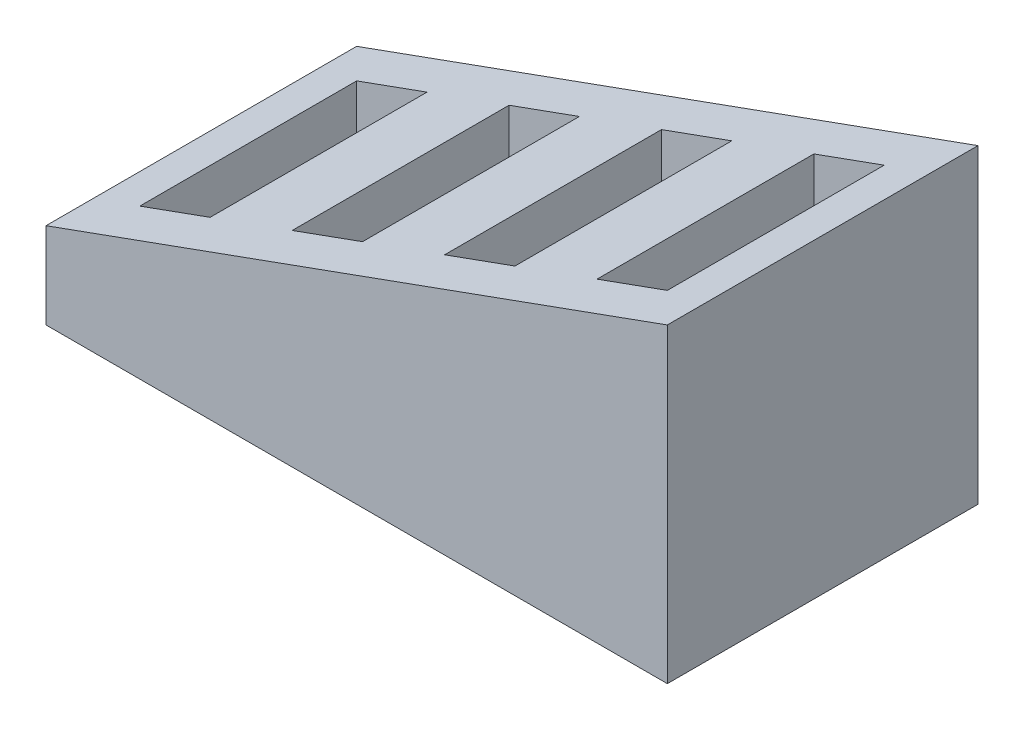
ISO-10303-21;
HEADER;
FILE_DESCRIPTION(('STEP AP214'),'2;1');
FILE_NAME('part.step','',(''),(''),'','','');
FILE_SCHEMA(('AUTOMOTIVE_DESIGN { 1 0 10303 214 1 1 1 1 }'));
ENDSEC;
DATA;
#1=APPLICATION_CONTEXT('core data for automotive mechanical design processes');
#2=APPLICATION_PROTOCOL_DEFINITION('international standard','automotive_design',2000,#1);
#3=PRODUCT_CONTEXT('',#1,'mechanical');
#4=PRODUCT('Part','Part','',(#3));
#5=PRODUCT_RELATED_PRODUCT_CATEGORY('part','',(#4));
#6=PRODUCT_DEFINITION_FORMATION('','',#4);
#7=PRODUCT_DEFINITION_CONTEXT('part definition',#1,'design');
#8=PRODUCT_DEFINITION('design','',#6,#7);
#9=PRODUCT_DEFINITION_SHAPE('','',#8);
#10=(LENGTH_UNIT() NAMED_UNIT(*) SI_UNIT(.MILLI.,.METRE.));
#11=(NAMED_UNIT(*) PLANE_ANGLE_UNIT() SI_UNIT($,.RADIAN.));
#12=(NAMED_UNIT(*) SI_UNIT($,.STERADIAN.) SOLID_ANGLE_UNIT());
#13=UNCERTAINTY_MEASURE_WITH_UNIT(LENGTH_MEASURE(1.E-05),#10,'distance_accuracy_value','');
#14=(GEOMETRIC_REPRESENTATION_CONTEXT(3) GLOBAL_UNCERTAINTY_ASSIGNED_CONTEXT((#13)) GLOBAL_UNIT_ASSIGNED_CONTEXT((#10,
#11,#12)) REPRESENTATION_CONTEXT('',''));
#15=CARTESIAN_POINT('',(0.,0.,0.));
#16=DIRECTION('',(0.,0.,1.));
#17=DIRECTION('',(1.,0.,0.));
#18=AXIS2_PLACEMENT_3D('',#15,#16,#17);
#19=CARTESIAN_POINT('',(-15.4919034710546,1.07152438082928,-7.95));
#20=DIRECTION('',(-0.34008044078782,0.940396349308929,0.));
#21=DIRECTION('',(-0.940396349308929,-0.34008044078782,0.));
#22=AXIS2_PLACEMENT_3D('',#19,#20,#21);
#23=PLANE('',#22);
#24=DIRECTION('',(-0.940396349308929,-0.34008044078782,0.));
#25=VECTOR('',#24,1.);
#26=CARTESIAN_POINT('',(-15.4919034710546,1.07152438082928,-6.75));
#27=LINE('',#26,#25);
#28=CARTESIAN_POINT('',(-10.8,2.76828192539306,-6.75));
#29=VERTEX_POINT('',#28);
#30=CARTESIAN_POINT('',(-12.9,2.00884796312891,-6.75));
#31=VERTEX_POINT('',#30);
#32=EDGE_CURVE('E261',#29,#31,#27,.T.);
#33=ORIENTED_EDGE('',*,*,#32,.F.);
#34=DIRECTION('',(0.,0.,1.));
#35=VECTOR('',#34,1.);
#36=CARTESIAN_POINT('',(-10.8,2.76828192539306,-7.95));
#37=LINE('',#36,#35);
#38=CARTESIAN_POINT('',(-10.8,2.76828192539306,-1.2));
#39=VERTEX_POINT('',#38);
#40=EDGE_CURVE('E227',#29,#39,#37,.T.);
#41=ORIENTED_EDGE('',*,*,#40,.T.);
#42=DIRECTION('',(-0.940396349308929,-0.34008044078782,0.));
#43=VECTOR('',#42,1.);
#44=CARTESIAN_POINT('',(-15.4919034710546,1.07152438082928,-1.2));
#45=LINE('',#44,#43);
#46=CARTESIAN_POINT('',(-12.9,2.00884796312891,-1.2));
#47=VERTEX_POINT('',#46);
#48=EDGE_CURVE('E183',#39,#47,#45,.T.);
#49=ORIENTED_EDGE('',*,*,#48,.T.);
#50=DIRECTION('',(0.,0.,-1.));
#51=VECTOR('',#50,1.);
#52=CARTESIAN_POINT('',(-12.9,2.00884796312891,-7.95));
#53=LINE('',#52,#51);
#54=EDGE_CURVE('E244',#47,#31,#53,.T.);
#55=ORIENTED_EDGE('',*,*,#54,.T.);
#56=EDGE_LOOP('',(#33,#41,#49,#55));
#57=FACE_BOUND('',#56,.T.);
#58=ADVANCED_FACE('F34',(#57),#23,.F.);
#59=CARTESIAN_POINT('',(-6.90000000000003,4.17865928388362,-1.2));
#60=VERTEX_POINT('',#59);
#61=CARTESIAN_POINT('',(-9.00000000000003,3.41922532161947,-1.2));
#62=VERTEX_POINT('',#61);
#63=EDGE_CURVE('E264',#60,#62,#45,.T.);
#64=ORIENTED_EDGE('',*,*,#63,.T.);
#65=DIRECTION('',(0.,0.,-1.));
#66=VECTOR('',#65,1.);
#67=CARTESIAN_POINT('',(-9.00000000000002,3.41922532161947,-7.95));
#68=LINE('',#67,#66);
#69=CARTESIAN_POINT('',(-9.00000000000003,3.41922532161947,-6.75));
#70=VERTEX_POINT('',#69);
#71=EDGE_CURVE('E222',#62,#70,#68,.T.);
#72=ORIENTED_EDGE('',*,*,#71,.T.);
#73=CARTESIAN_POINT('',(-6.90000000000003,4.17865928388362,-6.75));
#74=VERTEX_POINT('',#73);
#75=EDGE_CURVE('E267',#74,#70,#27,.T.);
#76=ORIENTED_EDGE('',*,*,#75,.F.);
#77=DIRECTION('',(0.,0.,1.));
#78=VECTOR('',#77,1.);
#79=CARTESIAN_POINT('',(-6.90000000000003,4.17865928388362,-7.95));
#80=LINE('',#79,#78);
#81=EDGE_CURVE('E217',#74,#60,#80,.T.);
#82=ORIENTED_EDGE('',*,*,#81,.T.);
#83=EDGE_LOOP('',(#64,#72,#76,#82));
#84=FACE_BOUND('',#83,.T.);
#85=ADVANCED_FACE('F334',(#84),#23,.F.);
#86=CARTESIAN_POINT('',(0.,0.,-7.95));
#87=DIRECTION('',(0.,-1.,0.));
#88=DIRECTION('',(1.,0.,0.));
#89=AXIS2_PLACEMENT_3D('',#86,#87,#88);
#90=PLANE('',#89);
#91=DIRECTION('',(1.,0.,0.));
#92=VECTOR('',#91,1.);
#93=CARTESIAN_POINT('',(0.,0.,0.));
#94=LINE('',#93,#92);
#95=CARTESIAN_POINT('',(-15.9,0.,0.));
#96=VERTEX_POINT('',#95);
#97=CARTESIAN_POINT('',(0.,0.,0.));
#98=VERTEX_POINT('',#97);
#99=EDGE_CURVE('E286',#96,#98,#94,.T.);
#100=ORIENTED_EDGE('',*,*,#99,.F.);
#101=DIRECTION('',(0.,0.,1.));
#102=VECTOR('',#101,1.);
#103=CARTESIAN_POINT('',(-15.9,0.,-7.95));
#104=LINE('',#103,#102);
#105=CARTESIAN_POINT('',(-15.9,0.,-7.95));
#106=VERTEX_POINT('',#105);
#107=EDGE_CURVE('E43',#106,#96,#104,.T.);
#108=ORIENTED_EDGE('',*,*,#107,.F.);
#109=DIRECTION('',(1.,0.,0.));
#110=VECTOR('',#109,1.);
#111=CARTESIAN_POINT('',(0.,0.,-7.95));
#112=LINE('',#111,#110);
#113=CARTESIAN_POINT('',(0.,0.,-7.95));
#114=VERTEX_POINT('',#113);
#115=EDGE_CURVE('E292',#106,#114,#112,.T.);
#116=ORIENTED_EDGE('',*,*,#115,.T.);
#117=DIRECTION('',(0.,0.,1.));
#118=VECTOR('',#117,1.);
#119=CARTESIAN_POINT('',(0.,0.,-7.95));
#120=LINE('',#119,#118);
#121=EDGE_CURVE('E11',#114,#98,#120,.T.);
#122=ORIENTED_EDGE('',*,*,#121,.T.);
#123=EDGE_LOOP('',(#100,#108,#116,#122));
#124=FACE_BOUND('',#123,.T.);
#125=DIRECTION('',(0.,0.,1.));
#126=VECTOR('',#125,1.);
#127=CARTESIAN_POINT('',(-14.7,0.,-7.95));
#128=LINE('',#127,#126);
#129=CARTESIAN_POINT('',(-14.7,0.,-6.75));
#130=VERTEX_POINT('',#129);
#131=CARTESIAN_POINT('',(-14.7,0.,-1.2));
#132=VERTEX_POINT('',#131);
#133=EDGE_CURVE('E277',#130,#132,#128,.T.);
#134=ORIENTED_EDGE('',*,*,#133,.T.);
#135=DIRECTION('',(1.,0.,0.));
#136=VECTOR('',#135,1.);
#137=CARTESIAN_POINT('',(0.,0.,-1.2));
#138=LINE('',#137,#136);
#139=CARTESIAN_POINT('',(-1.2,0.,-1.2));
#140=VERTEX_POINT('',#139);
#141=EDGE_CURVE('E262',#132,#140,#138,.T.);
#142=ORIENTED_EDGE('',*,*,#141,.T.);
#143=DIRECTION('',(0.,0.,1.));
#144=VECTOR('',#143,1.);
#145=CARTESIAN_POINT('',(-1.2,0.,-7.95));
#146=LINE('',#145,#144);
#147=CARTESIAN_POINT('',(-1.2,0.,-6.75));
#148=VERTEX_POINT('',#147);
#149=EDGE_CURVE('E180',#148,#140,#146,.T.);
#150=ORIENTED_EDGE('',*,*,#149,.F.);
#151=DIRECTION('',(1.,0.,0.));
#152=VECTOR('',#151,1.);
#153=CARTESIAN_POINT('',(0.,0.,-6.75));
#154=LINE('',#153,#152);
#155=EDGE_CURVE('E274',#130,#148,#154,.T.);
#156=ORIENTED_EDGE('',*,*,#155,.F.);
#157=EDGE_LOOP('',(#134,#142,#150,#156));
#158=FACE_BOUND('',#157,.T.);
#159=ADVANCED_FACE('F317',(#124,#158),#90,.T.);
#160=CARTESIAN_POINT('',(0.,7.95,-7.95));
#161=DIRECTION('',(1.,0.,0.));
#162=DIRECTION('',(0.,1.,0.));
#163=AXIS2_PLACEMENT_3D('',#160,#161,#162);
#164=PLANE('',#163);
#165=DIRECTION('',(0.,1.,0.));
#166=VECTOR('',#165,1.);
#167=CARTESIAN_POINT('',(0.,7.95,0.));
#168=LINE('',#167,#166);
#169=CARTESIAN_POINT('',(0.,7.95,0.));
#170=VERTEX_POINT('',#169);
#171=EDGE_CURVE('E276',#98,#170,#168,.T.);
#172=ORIENTED_EDGE('',*,*,#171,.F.);
#173=ORIENTED_EDGE('',*,*,#121,.F.);
#174=DIRECTION('',(0.,1.,0.));
#175=VECTOR('',#174,1.);
#176=CARTESIAN_POINT('',(0.,7.95,-7.95));
#177=LINE('',#176,#175);
#178=CARTESIAN_POINT('',(0.,7.95,-7.95));
#179=VERTEX_POINT('',#178);
#180=EDGE_CURVE('E282',#114,#179,#177,.T.);
#181=ORIENTED_EDGE('',*,*,#180,.T.);
#182=DIRECTION('',(0.,0.,1.));
#183=VECTOR('',#182,1.);
#184=CARTESIAN_POINT('',(0.,7.95,-7.95));
#185=LINE('',#184,#183);
#186=EDGE_CURVE('E38',#179,#170,#185,.T.);
#187=ORIENTED_EDGE('',*,*,#186,.T.);
#188=EDGE_LOOP('',(#172,#173,#181,#187));
#189=FACE_BOUND('',#188,.T.);
#190=ADVANCED_FACE('F36',(#189),#164,.T.);
#191=CARTESIAN_POINT('',(-15.9,0.,-7.95));
#192=DIRECTION('',(-1.,0.,0.));
#193=DIRECTION('',(0.,0.,1.));
#194=AXIS2_PLACEMENT_3D('',#191,#192,#193);
#195=PLANE('',#194);
#196=DIRECTION('',(0.,-1.,0.));
#197=VECTOR('',#196,1.);
#198=CARTESIAN_POINT('',(-15.9,0.,0.));
#199=LINE('',#198,#197);
#200=CARTESIAN_POINT('',(-15.9,2.2,0.));
#201=VERTEX_POINT('',#200);
#202=EDGE_CURVE('E300',#201,#96,#199,.T.);
#203=ORIENTED_EDGE('',*,*,#202,.F.);
#204=DIRECTION('',(0.,0.,1.));
#205=VECTOR('',#204,1.);
#206=CARTESIAN_POINT('',(-15.9,2.2,-7.95));
#207=LINE('',#206,#205);
#208=CARTESIAN_POINT('',(-15.9,2.2,-7.95));
#209=VERTEX_POINT('',#208);
#210=EDGE_CURVE('E305',#209,#201,#207,.T.);
#211=ORIENTED_EDGE('',*,*,#210,.F.);
#212=DIRECTION('',(0.,-1.,0.));
#213=VECTOR('',#212,1.);
#214=CARTESIAN_POINT('',(-15.9,0.,-7.95));
#215=LINE('',#214,#213);
#216=EDGE_CURVE('E289',#209,#106,#215,.T.);
#217=ORIENTED_EDGE('',*,*,#216,.T.);
#218=ORIENTED_EDGE('',*,*,#107,.T.);
#219=EDGE_LOOP('',(#203,#211,#217,#218));
#220=FACE_BOUND('',#219,.T.);
#221=ADVANCED_FACE('F324',(#220),#195,.T.);
#222=CARTESIAN_POINT('',(-15.9,2.2,-7.95));
#223=DIRECTION('',(-0.34008044078782,0.940396349308929,0.));
#224=DIRECTION('',(-0.940396349308929,-0.34008044078782,0.));
#225=AXIS2_PLACEMENT_3D('',#222,#223,#224);
#226=PLANE('',#225);
#227=DIRECTION('',(0.,0.,1.));
#228=VECTOR('',#227,1.);
#229=CARTESIAN_POINT('',(-10.8,4.04433962264151,-7.95));
#230=LINE('',#229,#228);
#231=CARTESIAN_POINT('',(-10.8,4.04433962264151,-6.75));
#232=VERTEX_POINT('',#231);
#233=CARTESIAN_POINT('',(-10.8,4.04433962264151,-1.2));
#234=VERTEX_POINT('',#233);
#235=EDGE_CURVE('E230',#232,#234,#230,.T.);
#236=ORIENTED_EDGE('',*,*,#235,.F.);
#237=DIRECTION('',(-0.940396349308929,-0.34008044078782,0.));
#238=VECTOR('',#237,1.);
#239=CARTESIAN_POINT('',(-15.9,2.2,-6.75));
#240=LINE('',#239,#238);
#241=CARTESIAN_POINT('',(-9.00000000000002,4.69528301886792,-6.75));
#242=VERTEX_POINT('',#241);
#243=EDGE_CURVE('E236',#242,#232,#240,.T.);
#244=ORIENTED_EDGE('',*,*,#243,.F.);
#245=DIRECTION('',(0.,0.,-1.));
#246=VECTOR('',#245,1.);
#247=CARTESIAN_POINT('',(-9.00000000000002,4.69528301886792,-7.95));
#248=LINE('',#247,#246);
#249=CARTESIAN_POINT('',(-9.00000000000003,4.69528301886792,-1.2));
#250=VERTEX_POINT('',#249);
#251=EDGE_CURVE('E225',#250,#242,#248,.T.);
#252=ORIENTED_EDGE('',*,*,#251,.F.);
#253=DIRECTION('',(0.940396349308929,0.34008044078782,0.));
#254=VECTOR('',#253,1.);
#255=CARTESIAN_POINT('',(-15.9,2.2,-1.2));
#256=LINE('',#255,#254);
#257=EDGE_CURVE('E238',#234,#250,#256,.T.);
#258=ORIENTED_EDGE('',*,*,#257,.F.);
#259=EDGE_LOOP('',(#236,#244,#252,#258));
#260=FACE_BOUND('',#259,.T.);
#261=DIRECTION('',(0.,0.,1.));
#262=VECTOR('',#261,1.);
#263=CARTESIAN_POINT('',(-6.90000000000003,5.45471698113207,-7.95));
#264=LINE('',#263,#262);
#265=CARTESIAN_POINT('',(-6.90000000000003,5.45471698113207,-6.75));
#266=VERTEX_POINT('',#265);
#267=CARTESIAN_POINT('',(-6.90000000000003,5.45471698113207,-1.2));
#268=VERTEX_POINT('',#267);
#269=EDGE_CURVE('E220',#266,#268,#264,.T.);
#270=ORIENTED_EDGE('',*,*,#269,.F.);
#271=DIRECTION('',(-0.940396349308929,-0.34008044078782,0.));
#272=VECTOR('',#271,1.);
#273=CARTESIAN_POINT('',(-15.9,2.2,-6.75000000000001));
#274=LINE('',#273,#272);
#275=CARTESIAN_POINT('',(-5.10000000000003,6.10566037735848,-6.75));
#276=VERTEX_POINT('',#275);
#277=EDGE_CURVE('E194',#276,#266,#274,.T.);
#278=ORIENTED_EDGE('',*,*,#277,.F.);
#279=DIRECTION('',(0.,0.,-1.));
#280=VECTOR('',#279,1.);
#281=CARTESIAN_POINT('',(-5.10000000000003,6.10566037735848,-7.95));
#282=LINE('',#281,#280);
#283=CARTESIAN_POINT('',(-5.10000000000003,6.10566037735848,-1.2));
#284=VERTEX_POINT('',#283);
#285=EDGE_CURVE('E215',#284,#276,#282,.T.);
#286=ORIENTED_EDGE('',*,*,#285,.F.);
#287=DIRECTION('',(0.940396349308929,0.34008044078782,0.));
#288=VECTOR('',#287,1.);
#289=CARTESIAN_POINT('',(-15.9,2.2,-1.2));
#290=LINE('',#289,#288);
#291=EDGE_CURVE('E234',#268,#284,#290,.T.);
#292=ORIENTED_EDGE('',*,*,#291,.F.);
#293=EDGE_LOOP('',(#270,#278,#286,#292));
#294=FACE_BOUND('',#293,.T.);
#295=DIRECTION('',(0.,0.,1.));
#296=VECTOR('',#295,1.);
#297=CARTESIAN_POINT('',(-3.00000000000003,6.86509433962263,-7.95));
#298=LINE('',#297,#296);
#299=CARTESIAN_POINT('',(-3.00000000000003,6.86509433962263,-6.75));
#300=VERTEX_POINT('',#299);
#301=CARTESIAN_POINT('',(-3.00000000000003,6.86509433962263,-1.2));
#302=VERTEX_POINT('',#301);
#303=EDGE_CURVE('E203',#300,#302,#298,.T.);
#304=ORIENTED_EDGE('',*,*,#303,.F.);
#305=DIRECTION('',(-0.940396349308929,-0.34008044078782,0.));
#306=VECTOR('',#305,1.);
#307=CARTESIAN_POINT('',(-15.9,2.2,-6.75000000000001));
#308=LINE('',#307,#306);
#309=CARTESIAN_POINT('',(-1.20000000000003,7.51603773584905,-6.75));
#310=VERTEX_POINT('',#309);
#311=EDGE_CURVE('E195',#310,#300,#308,.T.);
#312=ORIENTED_EDGE('',*,*,#311,.F.);
#313=DIRECTION('',(0.,0.,-1.));
#314=VECTOR('',#313,1.);
#315=CARTESIAN_POINT('',(-1.20000000000003,7.51603773584905,-7.95));
#316=LINE('',#315,#314);
#317=CARTESIAN_POINT('',(-1.20000000000003,7.51603773584905,-1.2));
#318=VERTEX_POINT('',#317);
#319=EDGE_CURVE('E177',#318,#310,#316,.T.);
#320=ORIENTED_EDGE('',*,*,#319,.F.);
#321=DIRECTION('',(0.940396349308929,0.34008044078782,0.));
#322=VECTOR('',#321,1.);
#323=CARTESIAN_POINT('',(-15.9,2.2,-1.2));
#324=LINE('',#323,#322);
#325=EDGE_CURVE('E188',#302,#318,#324,.T.);
#326=ORIENTED_EDGE('',*,*,#325,.F.);
#327=EDGE_LOOP('',(#304,#312,#320,#326));
#328=FACE_BOUND('',#327,.T.);
#329=DIRECTION('',(0.,0.,1.));
#330=VECTOR('',#329,1.);
#331=CARTESIAN_POINT('',(-14.7,2.63396226415094,-7.95));
#332=LINE('',#331,#330);
#333=CARTESIAN_POINT('',(-14.7,2.63396226415094,-6.75));
#334=VERTEX_POINT('',#333);
#335=CARTESIAN_POINT('',(-14.7,2.63396226415094,-1.2));
#336=VERTEX_POINT('',#335);
#337=EDGE_CURVE('E252',#334,#336,#332,.T.);
#338=ORIENTED_EDGE('',*,*,#337,.F.);
#339=DIRECTION('',(-0.940396349308929,-0.34008044078782,0.));
#340=VECTOR('',#339,1.);
#341=CARTESIAN_POINT('',(-15.9,2.2,-6.75));
#342=LINE('',#341,#340);
#343=CARTESIAN_POINT('',(-12.9,3.28490566037736,-6.75));
#344=VERTEX_POINT('',#343);
#345=EDGE_CURVE('E255',#344,#334,#342,.T.);
#346=ORIENTED_EDGE('',*,*,#345,.F.);
#347=DIRECTION('',(0.,0.,-1.));
#348=VECTOR('',#347,1.);
#349=CARTESIAN_POINT('',(-12.9,3.28490566037735,-7.95));
#350=LINE('',#349,#348);
#351=CARTESIAN_POINT('',(-12.9,3.28490566037735,-1.2));
#352=VERTEX_POINT('',#351);
#353=EDGE_CURVE('E249',#352,#344,#350,.T.);
#354=ORIENTED_EDGE('',*,*,#353,.F.);
#355=DIRECTION('',(0.940396349308929,0.34008044078782,0.));
#356=VECTOR('',#355,1.);
#357=CARTESIAN_POINT('',(-15.9,2.2,-1.2));
#358=LINE('',#357,#356);
#359=EDGE_CURVE('E184',#336,#352,#358,.T.);
#360=ORIENTED_EDGE('',*,*,#359,.F.);
#361=EDGE_LOOP('',(#338,#346,#354,#360));
#362=FACE_BOUND('',#361,.T.);
#363=DIRECTION('',(-0.940396349308929,-0.34008044078782,0.));
#364=VECTOR('',#363,1.);
#365=CARTESIAN_POINT('',(-15.9,2.2,0.));
#366=LINE('',#365,#364);
#367=EDGE_CURVE('E297',#170,#201,#366,.T.);
#368=ORIENTED_EDGE('',*,*,#367,.F.);
#369=ORIENTED_EDGE('',*,*,#186,.F.);
#370=DIRECTION('',(-0.940396349308929,-0.34008044078782,0.));
#371=VECTOR('',#370,1.);
#372=CARTESIAN_POINT('',(-15.9,2.2,-7.95));
#373=LINE('',#372,#371);
#374=EDGE_CURVE('E285',#179,#209,#373,.T.);
#375=ORIENTED_EDGE('',*,*,#374,.T.);
#376=ORIENTED_EDGE('',*,*,#210,.T.);
#377=EDGE_LOOP('',(#368,#369,#375,#376));
#378=FACE_BOUND('',#377,.T.);
#379=ADVANCED_FACE('F197',(#260,#294,#328,#362,#378),#226,.T.);
#380=CARTESIAN_POINT('',(0.,0.,-7.95));
#381=DIRECTION('',(0.,0.,-1.));
#382=DIRECTION('',(-1.,0.,0.));
#383=AXIS2_PLACEMENT_3D('',#380,#381,#382);
#384=PLANE('',#383);
#385=ORIENTED_EDGE('',*,*,#180,.F.);
#386=ORIENTED_EDGE('',*,*,#115,.F.);
#387=ORIENTED_EDGE('',*,*,#216,.F.);
#388=ORIENTED_EDGE('',*,*,#374,.F.);
#389=EDGE_LOOP('',(#385,#386,#387,#388));
#390=FACE_BOUND('',#389,.T.);
#391=ADVANCED_FACE('F321',(#390),#384,.T.);
#392=CARTESIAN_POINT('',(0.,0.,0.));
#393=DIRECTION('',(0.,0.,-1.));
#394=DIRECTION('',(-1.,0.,0.));
#395=AXIS2_PLACEMENT_3D('',#392,#393,#394);
#396=PLANE('',#395);
#397=ORIENTED_EDGE('',*,*,#171,.T.);
#398=ORIENTED_EDGE('',*,*,#367,.T.);
#399=ORIENTED_EDGE('',*,*,#202,.T.);
#400=ORIENTED_EDGE('',*,*,#99,.T.);
#401=EDGE_LOOP('',(#397,#398,#399,#400));
#402=FACE_BOUND('',#401,.T.);
#403=ADVANCED_FACE('F314',(#402),#396,.F.);
#404=CARTESIAN_POINT('',(-1.2,7.95,-7.95));
#405=DIRECTION('',(1.,0.,0.));
#406=DIRECTION('',(0.,1.,0.));
#407=AXIS2_PLACEMENT_3D('',#404,#405,#406);
#408=PLANE('',#407);
#409=DIRECTION('',(0.,1.,0.));
#410=VECTOR('',#409,1.);
#411=CARTESIAN_POINT('',(-1.2,7.95,-1.2));
#412=LINE('',#411,#410);
#413=EDGE_CURVE('E172',#140,#318,#412,.T.);
#414=ORIENTED_EDGE('',*,*,#413,.T.);
#415=ORIENTED_EDGE('',*,*,#319,.T.);
#416=DIRECTION('',(0.,1.,0.));
#417=VECTOR('',#416,1.);
#418=CARTESIAN_POINT('',(-1.2,7.95,-6.75));
#419=LINE('',#418,#417);
#420=EDGE_CURVE('E259',#148,#310,#419,.T.);
#421=ORIENTED_EDGE('',*,*,#420,.F.);
#422=ORIENTED_EDGE('',*,*,#149,.T.);
#423=EDGE_LOOP('',(#414,#415,#421,#422));
#424=FACE_BOUND('',#423,.T.);
#425=ADVANCED_FACE('F174',(#424),#408,.F.);
#426=CARTESIAN_POINT('',(-14.7,0.,-7.95));
#427=DIRECTION('',(-1.,0.,0.));
#428=DIRECTION('',(0.,0.,1.));
#429=AXIS2_PLACEMENT_3D('',#426,#427,#428);
#430=PLANE('',#429);
#431=DIRECTION('',(0.,-1.,0.));
#432=VECTOR('',#431,1.);
#433=CARTESIAN_POINT('',(-14.7,0.,-1.2));
#434=LINE('',#433,#432);
#435=EDGE_CURVE('E269',#336,#132,#434,.T.);
#436=ORIENTED_EDGE('',*,*,#435,.T.);
#437=ORIENTED_EDGE('',*,*,#133,.F.);
#438=DIRECTION('',(0.,-1.,0.));
#439=VECTOR('',#438,1.);
#440=CARTESIAN_POINT('',(-14.7,0.,-6.75));
#441=LINE('',#440,#439);
#442=EDGE_CURVE('E271',#334,#130,#441,.T.);
#443=ORIENTED_EDGE('',*,*,#442,.F.);
#444=ORIENTED_EDGE('',*,*,#337,.T.);
#445=EDGE_LOOP('',(#436,#437,#443,#444));
#446=FACE_BOUND('',#445,.T.);
#447=ADVANCED_FACE('F347',(#446),#430,.F.);
#448=CARTESIAN_POINT('',(-3.00000000000003,5.58903664237418,-1.2));
#449=VERTEX_POINT('',#448);
#450=CARTESIAN_POINT('',(-5.10000000000003,4.82960268011004,-1.2));
#451=VERTEX_POINT('',#450);
#452=EDGE_CURVE('E265',#449,#451,#45,.T.);
#453=ORIENTED_EDGE('',*,*,#452,.T.);
#454=DIRECTION('',(0.,0.,-1.));
#455=VECTOR('',#454,1.);
#456=CARTESIAN_POINT('',(-5.10000000000003,4.82960268011003,-7.95));
#457=LINE('',#456,#455);
#458=CARTESIAN_POINT('',(-5.10000000000003,4.82960268011004,-6.75));
#459=VERTEX_POINT('',#458);
#460=EDGE_CURVE('E212',#451,#459,#457,.T.);
#461=ORIENTED_EDGE('',*,*,#460,.T.);
#462=CARTESIAN_POINT('',(-3.00000000000003,5.58903664237418,-6.75));
#463=VERTEX_POINT('',#462);
#464=EDGE_CURVE('E268',#463,#459,#27,.T.);
#465=ORIENTED_EDGE('',*,*,#464,.F.);
#466=DIRECTION('',(0.,0.,1.));
#467=VECTOR('',#466,1.);
#468=CARTESIAN_POINT('',(-3.00000000000003,5.58903664237418,-7.95));
#469=LINE('',#468,#467);
#470=EDGE_CURVE('E199',#463,#449,#469,.T.);
#471=ORIENTED_EDGE('',*,*,#470,.T.);
#472=EDGE_LOOP('',(#453,#461,#465,#471));
#473=FACE_BOUND('',#472,.T.);
#474=ADVANCED_FACE('F337',(#473),#23,.F.);
#475=CARTESIAN_POINT('',(0.,0.,-6.75));
#476=DIRECTION('',(0.,0.,-1.));
#477=DIRECTION('',(-1.,0.,0.));
#478=AXIS2_PLACEMENT_3D('',#475,#476,#477);
#479=PLANE('',#478);
#480=ORIENTED_EDGE('',*,*,#464,.T.);
#481=DIRECTION('',(0.,-1.,0.));
#482=VECTOR('',#481,1.);
#483=CARTESIAN_POINT('',(-5.10000000000003,7.95,-6.75));
#484=LINE('',#483,#482);
#485=EDGE_CURVE('E58',#276,#459,#484,.T.);
#486=ORIENTED_EDGE('',*,*,#485,.F.);
#487=ORIENTED_EDGE('',*,*,#277,.T.);
#488=DIRECTION('',(0.,-1.,0.));
#489=VECTOR('',#488,1.);
#490=CARTESIAN_POINT('',(-6.90000000000003,7.95,-6.75));
#491=LINE('',#490,#489);
#492=EDGE_CURVE('E380',#266,#74,#491,.T.);
#493=ORIENTED_EDGE('',*,*,#492,.T.);
#494=ORIENTED_EDGE('',*,*,#75,.T.);
#495=DIRECTION('',(0.,-1.,0.));
#496=VECTOR('',#495,1.);
#497=CARTESIAN_POINT('',(-9.00000000000003,7.95,-6.75));
#498=LINE('',#497,#496);
#499=EDGE_CURVE('E51',#242,#70,#498,.T.);
#500=ORIENTED_EDGE('',*,*,#499,.F.);
#501=ORIENTED_EDGE('',*,*,#243,.T.);
#502=DIRECTION('',(0.,-1.,0.));
#503=VECTOR('',#502,1.);
#504=CARTESIAN_POINT('',(-10.8,7.95,-6.75));
#505=LINE('',#504,#503);
#506=EDGE_CURVE('E372',#232,#29,#505,.T.);
#507=ORIENTED_EDGE('',*,*,#506,.T.);
#508=ORIENTED_EDGE('',*,*,#32,.T.);
#509=DIRECTION('',(0.,-1.,0.));
#510=VECTOR('',#509,1.);
#511=CARTESIAN_POINT('',(-12.9,7.95,-6.75));
#512=LINE('',#511,#510);
#513=EDGE_CURVE('E240',#344,#31,#512,.T.);
#514=ORIENTED_EDGE('',*,*,#513,.F.);
#515=ORIENTED_EDGE('',*,*,#345,.T.);
#516=ORIENTED_EDGE('',*,*,#442,.T.);
#517=ORIENTED_EDGE('',*,*,#155,.T.);
#518=ORIENTED_EDGE('',*,*,#420,.T.);
#519=ORIENTED_EDGE('',*,*,#311,.T.);
#520=DIRECTION('',(0.,-1.,0.));
#521=VECTOR('',#520,1.);
#522=CARTESIAN_POINT('',(-3.00000000000003,7.95,-6.75));
#523=LINE('',#522,#521);
#524=EDGE_CURVE('E208',#300,#463,#523,.T.);
#525=ORIENTED_EDGE('',*,*,#524,.T.);
#526=EDGE_LOOP('',(#480,#486,#487,#493,#494,#500,#501,#507,#508,#514,#515,#516,#517,#518,#519,#525));
#527=FACE_BOUND('',#526,.T.);
#528=ADVANCED_FACE('F346',(#527),#479,.F.);
#529=CARTESIAN_POINT('',(0.,0.,-1.2));
#530=DIRECTION('',(0.,0.,-1.));
#531=DIRECTION('',(-1.,0.,0.));
#532=AXIS2_PLACEMENT_3D('',#529,#530,#531);
#533=PLANE('',#532);
#534=ORIENTED_EDGE('',*,*,#413,.F.);
#535=ORIENTED_EDGE('',*,*,#141,.F.);
#536=ORIENTED_EDGE('',*,*,#435,.F.);
#537=ORIENTED_EDGE('',*,*,#359,.T.);
#538=DIRECTION('',(0.,-1.,0.));
#539=VECTOR('',#538,1.);
#540=CARTESIAN_POINT('',(-12.9,7.95,-1.2));
#541=LINE('',#540,#539);
#542=EDGE_CURVE('E241',#352,#47,#541,.T.);
#543=ORIENTED_EDGE('',*,*,#542,.T.);
#544=ORIENTED_EDGE('',*,*,#48,.F.);
#545=DIRECTION('',(0.,-1.,0.));
#546=VECTOR('',#545,1.);
#547=CARTESIAN_POINT('',(-10.8,7.95,-1.2));
#548=LINE('',#547,#546);
#549=EDGE_CURVE('E200',#234,#39,#548,.T.);
#550=ORIENTED_EDGE('',*,*,#549,.F.);
#551=ORIENTED_EDGE('',*,*,#257,.T.);
#552=DIRECTION('',(0.,-1.,0.));
#553=VECTOR('',#552,1.);
#554=CARTESIAN_POINT('',(-9.00000000000003,7.95,-1.2));
#555=LINE('',#554,#553);
#556=EDGE_CURVE('E205',#250,#62,#555,.T.);
#557=ORIENTED_EDGE('',*,*,#556,.T.);
#558=ORIENTED_EDGE('',*,*,#63,.F.);
#559=DIRECTION('',(0.,-1.,0.));
#560=VECTOR('',#559,1.);
#561=CARTESIAN_POINT('',(-6.90000000000003,7.95,-1.2));
#562=LINE('',#561,#560);
#563=EDGE_CURVE('E364',#268,#60,#562,.T.);
#564=ORIENTED_EDGE('',*,*,#563,.F.);
#565=ORIENTED_EDGE('',*,*,#291,.T.);
#566=DIRECTION('',(0.,-1.,0.));
#567=VECTOR('',#566,1.);
#568=CARTESIAN_POINT('',(-5.10000000000003,7.95,-1.2));
#569=LINE('',#568,#567);
#570=EDGE_CURVE('E377',#284,#451,#569,.T.);
#571=ORIENTED_EDGE('',*,*,#570,.T.);
#572=ORIENTED_EDGE('',*,*,#452,.F.);
#573=DIRECTION('',(0.,-1.,0.));
#574=VECTOR('',#573,1.);
#575=CARTESIAN_POINT('',(-3.00000000000003,7.95,-1.2));
#576=LINE('',#575,#574);
#577=EDGE_CURVE('E191',#302,#449,#576,.T.);
#578=ORIENTED_EDGE('',*,*,#577,.F.);
#579=ORIENTED_EDGE('',*,*,#325,.T.);
#580=EDGE_LOOP('',(#534,#535,#536,#537,#543,#544,#550,#551,#557,#558,#564,#565,#571,#572,#578,#579));
#581=FACE_BOUND('',#580,.T.);
#582=ADVANCED_FACE('F189',(#581),#533,.T.);
#583=CARTESIAN_POINT('',(-12.9,7.95,-6.75));
#584=DIRECTION('',(1.,0.,0.));
#585=DIRECTION('',(0.,1.,0.));
#586=AXIS2_PLACEMENT_3D('',#583,#584,#585);
#587=PLANE('',#586);
#588=ORIENTED_EDGE('',*,*,#353,.T.);
#589=ORIENTED_EDGE('',*,*,#513,.T.);
#590=ORIENTED_EDGE('',*,*,#54,.F.);
#591=ORIENTED_EDGE('',*,*,#542,.F.);
#592=EDGE_LOOP('',(#588,#589,#590,#591));
#593=FACE_BOUND('',#592,.T.);
#594=ADVANCED_FACE('F409',(#593),#587,.F.);
#595=CARTESIAN_POINT('',(-3.00000000000003,7.95,-6.75));
#596=DIRECTION('',(-1.,0.,0.));
#597=DIRECTION('',(0.,-1.,0.));
#598=AXIS2_PLACEMENT_3D('',#595,#596,#597);
#599=PLANE('',#598);
#600=ORIENTED_EDGE('',*,*,#303,.T.);
#601=ORIENTED_EDGE('',*,*,#577,.T.);
#602=ORIENTED_EDGE('',*,*,#470,.F.);
#603=ORIENTED_EDGE('',*,*,#524,.F.);
#604=EDGE_LOOP('',(#600,#601,#602,#603));
#605=FACE_BOUND('',#604,.T.);
#606=ADVANCED_FACE('F383',(#605),#599,.F.);
#607=CARTESIAN_POINT('',(-6.90000000000003,7.95,-6.75));
#608=DIRECTION('',(-1.,0.,0.));
#609=DIRECTION('',(0.,-1.,0.));
#610=AXIS2_PLACEMENT_3D('',#607,#608,#609);
#611=PLANE('',#610);
#612=ORIENTED_EDGE('',*,*,#269,.T.);
#613=ORIENTED_EDGE('',*,*,#563,.T.);
#614=ORIENTED_EDGE('',*,*,#81,.F.);
#615=ORIENTED_EDGE('',*,*,#492,.F.);
#616=EDGE_LOOP('',(#612,#613,#614,#615));
#617=FACE_BOUND('',#616,.T.);
#618=ADVANCED_FACE('F388',(#617),#611,.F.);
#619=CARTESIAN_POINT('',(-5.10000000000003,7.95,-6.75));
#620=DIRECTION('',(1.,0.,0.));
#621=DIRECTION('',(0.,1.,0.));
#622=AXIS2_PLACEMENT_3D('',#619,#620,#621);
#623=PLANE('',#622);
#624=ORIENTED_EDGE('',*,*,#285,.T.);
#625=ORIENTED_EDGE('',*,*,#485,.T.);
#626=ORIENTED_EDGE('',*,*,#460,.F.);
#627=ORIENTED_EDGE('',*,*,#570,.F.);
#628=EDGE_LOOP('',(#624,#625,#626,#627));
#629=FACE_BOUND('',#628,.T.);
#630=ADVANCED_FACE('F393',(#629),#623,.F.);
#631=CARTESIAN_POINT('',(-10.8,7.95,-6.75));
#632=DIRECTION('',(-1.,0.,0.));
#633=DIRECTION('',(0.,-1.,0.));
#634=AXIS2_PLACEMENT_3D('',#631,#632,#633);
#635=PLANE('',#634);
#636=ORIENTED_EDGE('',*,*,#235,.T.);
#637=ORIENTED_EDGE('',*,*,#549,.T.);
#638=ORIENTED_EDGE('',*,*,#40,.F.);
#639=ORIENTED_EDGE('',*,*,#506,.F.);
#640=EDGE_LOOP('',(#636,#637,#638,#639));
#641=FACE_BOUND('',#640,.T.);
#642=ADVANCED_FACE('F395',(#641),#635,.F.);
#643=CARTESIAN_POINT('',(-9.00000000000003,7.95,-6.75));
#644=DIRECTION('',(1.,0.,0.));
#645=DIRECTION('',(0.,1.,0.));
#646=AXIS2_PLACEMENT_3D('',#643,#644,#645);
#647=PLANE('',#646);
#648=ORIENTED_EDGE('',*,*,#251,.T.);
#649=ORIENTED_EDGE('',*,*,#499,.T.);
#650=ORIENTED_EDGE('',*,*,#71,.F.);
#651=ORIENTED_EDGE('',*,*,#556,.F.);
#652=EDGE_LOOP('',(#648,#649,#650,#651));
#653=FACE_BOUND('',#652,.T.);
#654=ADVANCED_FACE('F401',(#653),#647,.F.);
#655=CLOSED_SHELL('',(#58,#85,#159,#190,#221,#379,#391,#403,#425,#447,#474,#528,#582,#594,#606,
#618,#630,#642,#654));
#656=MANIFOLD_SOLID_BREP('B2',#655);
#657=ADVANCED_BREP_SHAPE_REPRESENTATION('',(#18,#656),#14);
#658=SHAPE_DEFINITION_REPRESENTATION(#9,#657);
ENDSEC;
END-ISO-10303-21;
